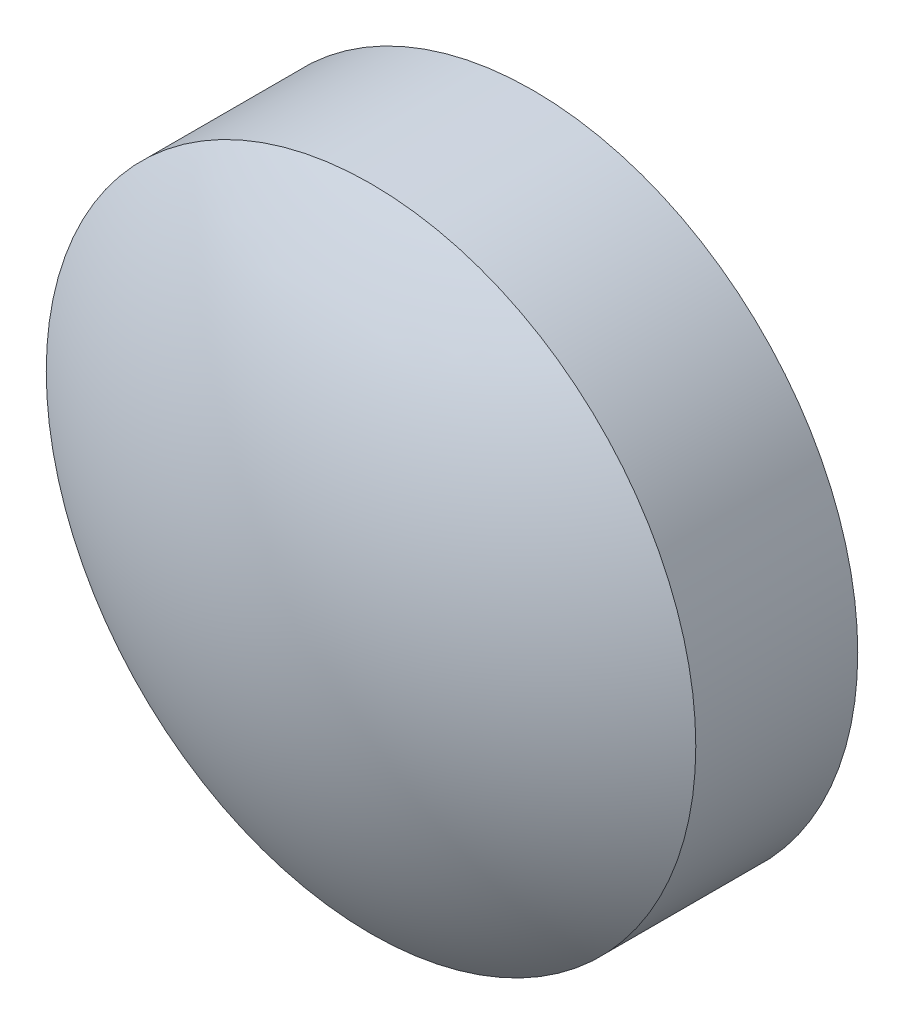
ISO-10303-21;
HEADER;
FILE_DESCRIPTION(('STEP AP214'),'2;1');
FILE_NAME('part.step','',(''),(''),'','','');
FILE_SCHEMA(('AUTOMOTIVE_DESIGN { 1 0 10303 214 1 1 1 1 }'));
ENDSEC;
DATA;
#1=APPLICATION_CONTEXT('core data for automotive mechanical design processes');
#2=APPLICATION_PROTOCOL_DEFINITION('international standard','automotive_design',2000,#1);
#3=PRODUCT_CONTEXT('',#1,'mechanical');
#4=PRODUCT('Part','Part','',(#3));
#5=PRODUCT_RELATED_PRODUCT_CATEGORY('part','',(#4));
#6=PRODUCT_DEFINITION_FORMATION('','',#4);
#7=PRODUCT_DEFINITION_CONTEXT('part definition',#1,'design');
#8=PRODUCT_DEFINITION('design','',#6,#7);
#9=PRODUCT_DEFINITION_SHAPE('','',#8);
#10=(LENGTH_UNIT() NAMED_UNIT(*) SI_UNIT(.MILLI.,.METRE.));
#11=(NAMED_UNIT(*) PLANE_ANGLE_UNIT() SI_UNIT($,.RADIAN.));
#12=(NAMED_UNIT(*) SI_UNIT($,.STERADIAN.) SOLID_ANGLE_UNIT());
#13=UNCERTAINTY_MEASURE_WITH_UNIT(LENGTH_MEASURE(1.E-05),#10,'distance_accuracy_value','');
#14=(GEOMETRIC_REPRESENTATION_CONTEXT(3) GLOBAL_UNCERTAINTY_ASSIGNED_CONTEXT((#13)) GLOBAL_UNIT_ASSIGNED_CONTEXT((#10,
#11,#12)) REPRESENTATION_CONTEXT('',''));
#15=CARTESIAN_POINT('',(0.,0.,0.));
#16=DIRECTION('',(0.,0.,1.));
#17=DIRECTION('',(1.,0.,0.));
#18=AXIS2_PLACEMENT_3D('',#15,#16,#17);
#19=CARTESIAN_POINT('',(0.,0.,-1.23));
#20=DIRECTION('',(0.,0.,1.));
#21=DIRECTION('',(1.,0.,0.));
#22=AXIS2_PLACEMENT_3D('',#19,#20,#21);
#23=CYLINDRICAL_SURFACE('',#22,3.);
#24=CARTESIAN_POINT('',(0.,0.,-1.23));
#25=DIRECTION('',(0.,0.,1.));
#26=DIRECTION('',(1.,0.,0.));
#27=AXIS2_PLACEMENT_3D('',#24,#25,#26);
#28=CIRCLE('',#27,3.);
#29=CARTESIAN_POINT('',(3.,0.,-1.23));
#30=VERTEX_POINT('',#29);
#31=EDGE_CURVE('E10',#30,#30,#28,.T.);
#32=ORIENTED_EDGE('',*,*,#31,.T.);
#33=EDGE_LOOP('',(#32));
#34=FACE_BOUND('',#33,.T.);
#35=CARTESIAN_POINT('',(0.,0.,0.265988533190221));
#36=DIRECTION('',(0.,0.,1.));
#37=DIRECTION('',(1.,0.,0.));
#38=AXIS2_PLACEMENT_3D('',#35,#36,#37);
#39=CIRCLE('',#38,3.);
#40=CARTESIAN_POINT('',(3.,0.,0.265988533190221));
#41=VERTEX_POINT('',#40);
#42=EDGE_CURVE('E40',#41,#41,#39,.T.);
#43=ORIENTED_EDGE('',*,*,#42,.F.);
#44=EDGE_LOOP('',(#43));
#45=FACE_BOUND('',#44,.T.);
#46=ADVANCED_FACE('F34',(#34,#45),#23,.T.);
#47=CARTESIAN_POINT('',(3.,0.,-1.23));
#48=DIRECTION('',(0.,0.,-1.));
#49=DIRECTION('',(-1.,0.,0.));
#50=AXIS2_PLACEMENT_3D('',#47,#48,#49);
#51=PLANE('',#50);
#52=ORIENTED_EDGE('',*,*,#31,.F.);
#53=EDGE_LOOP('',(#52));
#54=FACE_BOUND('',#53,.T.);
#55=ADVANCED_FACE('F49',(#54),#51,.T.);
#56=CARTESIAN_POINT('',(0.,0.,-3.92));
#57=DIRECTION('',(0.,0.,1.));
#58=DIRECTION('',(-1.,0.,0.));
#59=AXIS2_PLACEMENT_3D('',#56,#57,#58);
#60=SPHERICAL_SURFACE('',#59,5.15);
#61=ORIENTED_EDGE('',*,*,#42,.T.);
#62=EDGE_LOOP('',(#61));
#63=FACE_BOUND('',#62,.T.);
#64=ADVANCED_FACE('F46',(#63),#60,.T.);
#65=CLOSED_SHELL('',(#46,#55,#64));
#66=MANIFOLD_SOLID_BREP('B2',#65);
#67=ADVANCED_BREP_SHAPE_REPRESENTATION('',(#18,#66),#14);
#68=SHAPE_DEFINITION_REPRESENTATION(#9,#67);
ENDSEC;
END-ISO-10303-21;
